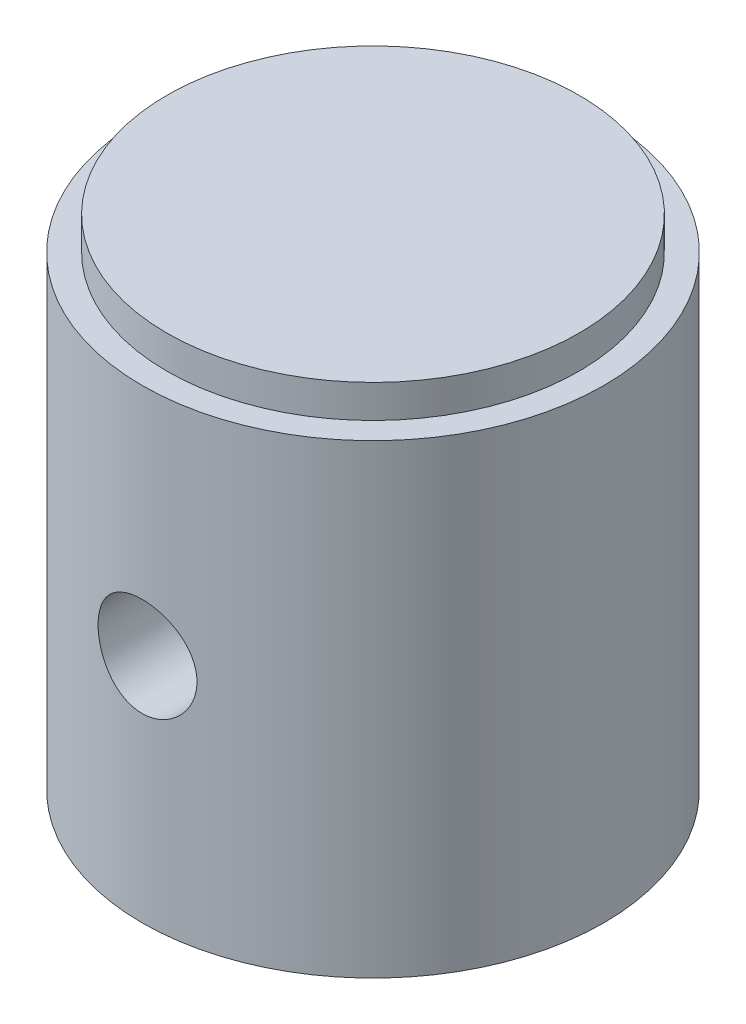
ISO-10303-21;
HEADER;
FILE_DESCRIPTION(('STEP AP214'),'2;1');
FILE_NAME('part.step','',(''),(''),'','','');
FILE_SCHEMA(('AUTOMOTIVE_DESIGN { 1 0 10303 214 1 1 1 1 }'));
ENDSEC;
DATA;
#1=APPLICATION_CONTEXT('core data for automotive mechanical design processes');
#2=APPLICATION_PROTOCOL_DEFINITION('international standard','automotive_design',2000,#1);
#3=PRODUCT_CONTEXT('',#1,'mechanical');
#4=PRODUCT('Part','Part','',(#3));
#5=PRODUCT_RELATED_PRODUCT_CATEGORY('part','',(#4));
#6=PRODUCT_DEFINITION_FORMATION('','',#4);
#7=PRODUCT_DEFINITION_CONTEXT('part definition',#1,'design');
#8=PRODUCT_DEFINITION('design','',#6,#7);
#9=PRODUCT_DEFINITION_SHAPE('','',#8);
#10=(LENGTH_UNIT() NAMED_UNIT(*) SI_UNIT(.MILLI.,.METRE.));
#11=(NAMED_UNIT(*) PLANE_ANGLE_UNIT() SI_UNIT($,.RADIAN.));
#12=(NAMED_UNIT(*) SI_UNIT($,.STERADIAN.) SOLID_ANGLE_UNIT());
#13=UNCERTAINTY_MEASURE_WITH_UNIT(LENGTH_MEASURE(1.E-05),#10,'distance_accuracy_value','');
#14=(GEOMETRIC_REPRESENTATION_CONTEXT(3) GLOBAL_UNCERTAINTY_ASSIGNED_CONTEXT((#13)) GLOBAL_UNIT_ASSIGNED_CONTEXT((#10,
#11,#12)) REPRESENTATION_CONTEXT('',''));
#15=CARTESIAN_POINT('',(0.,0.,0.));
#16=DIRECTION('',(0.,0.,1.));
#17=DIRECTION('',(1.,0.,0.));
#18=AXIS2_PLACEMENT_3D('',#15,#16,#17);
#19=CARTESIAN_POINT('',(0.,15.9635891289645,0.));
#20=DIRECTION('',(0.,-1.,0.));
#21=DIRECTION('',(0.,0.,-1.));
#22=AXIS2_PLACEMENT_3D('',#19,#20,#21);
#23=CONICAL_SURFACE('',#22,4.39164814667686,0.349065850398866);
#24=CARTESIAN_POINT('',(0.,11.9866629451071,0.));
#25=DIRECTION('',(0.,1.,0.));
#26=DIRECTION('',(0.,0.,1.));
#27=AXIS2_PLACEMENT_3D('',#24,#25,#26);
#28=CIRCLE('',#27,5.83913090147486);
#29=CARTESIAN_POINT('',(0.,11.9866629451071,5.83913090147486));
#30=VERTEX_POINT('',#29);
#31=EDGE_CURVE('E82',#30,#30,#28,.T.);
#32=ORIENTED_EDGE('',*,*,#31,.F.);
#33=EDGE_LOOP('',(#32));
#34=FACE_BOUND('',#33,.T.);
#35=CARTESIAN_POINT('',(0.,15.9635891289645,0.));
#36=DIRECTION('',(0.,1.,0.));
#37=DIRECTION('',(0.,0.,1.));
#38=AXIS2_PLACEMENT_3D('',#35,#36,#37);
#39=CIRCLE('',#38,4.39164814667686);
#40=CARTESIAN_POINT('',(0.,15.9635891289645,4.39164814667686));
#41=VERTEX_POINT('',#40);
#42=EDGE_CURVE('E85',#41,#41,#39,.T.);
#43=ORIENTED_EDGE('',*,*,#42,.T.);
#44=EDGE_LOOP('',(#43));
#45=FACE_BOUND('',#44,.T.);
#46=ADVANCED_FACE('F45',(#34,#45),#23,.F.);
#47=CARTESIAN_POINT('',(0.,-49.5119169152262,0.));
#48=DIRECTION('',(0.,1.,0.));
#49=DIRECTION('',(0.,0.,1.));
#50=AXIS2_PLACEMENT_3D('',#47,#48,#49);
#51=CYLINDRICAL_SURFACE('',#50,4.39164814667687);
#52=CARTESIAN_POINT('',(0.,17.4866629451071,4.39164814667687));
#53=CARTESIAN_POINT('',(0.0817294489079291,17.4866621455379,4.39164868377156));
#54=CARTESIAN_POINT('',(0.163453316832551,17.4933642389555,4.38934582266555));
#55=CARTESIAN_POINT('',(0.32448701010321,17.5199085710752,4.38038667126236));
#56=CARTESIAN_POINT('',(0.403796702768455,17.5397515306281,4.37373014214215));
#57=CARTESIAN_POINT('',(0.557657274641662,17.5918132402795,4.35678530776044));
#58=CARTESIAN_POINT('',(0.632216089607796,17.6240106862873,4.34650325681346));
#59=CARTESIAN_POINT('',(0.774874499462276,17.6997688133632,4.32335198157691));
#60=CARTESIAN_POINT('',(0.842972718736372,17.7433319070758,4.31048220811133));
#61=CARTESIAN_POINT('',(0.973238412709967,17.8422368756258,4.28298482885952));
#62=CARTESIAN_POINT('',(1.03514032978878,17.8979163065187,4.26831360910754));
#63=CARTESIAN_POINT('',(1.14893297228971,18.0187560367412,4.23910183809452));
#64=CARTESIAN_POINT('',(1.2008213430564,18.083918559688,4.2245613183317));
#65=CARTESIAN_POINT('',(1.29466178519018,18.2243036745552,4.19677232209295));
#66=CARTESIAN_POINT('',(1.33626305373444,18.2997722378693,4.18357669220338));
#67=CARTESIAN_POINT('',(1.40606835780822,18.4571579794045,4.16063760334802));
#68=CARTESIAN_POINT('',(1.4342767159436,18.5390730670246,4.15089303080048));
#69=CARTESIAN_POINT('',(1.4754892588746,18.7039985651193,4.13641992382677));
#70=CARTESIAN_POINT('',(1.48899294541784,18.7868693048427,4.13152713917476));
#71=CARTESIAN_POINT('',(1.50197455192036,18.9538336434625,4.1268266437341));
#72=CARTESIAN_POINT('',(1.50145706573326,19.0379268328144,4.12701726743296));
#73=CARTESIAN_POINT('',(1.48679770855611,19.2006334004601,4.13231854511336));
#74=CARTESIAN_POINT('',(1.47331502490099,19.279315288484,4.13719114498535));
#75=CARTESIAN_POINT('',(1.4341860672897,19.4332246434377,4.15091667228524));
#76=CARTESIAN_POINT('',(1.40853826854911,19.5084516760365,4.15977009866559));
#77=CARTESIAN_POINT('',(1.34538918588757,19.6547840356847,4.18062422299566));
#78=CARTESIAN_POINT('',(1.30769729040637,19.725799664015,4.19267496230931));
#79=CARTESIAN_POINT('',(1.22166231658171,19.8607032099629,4.21854574298595));
#80=CARTESIAN_POINT('',(1.17331604024451,19.924588978807,4.23236631505488));
#81=CARTESIAN_POINT('',(1.06420712885222,20.0471135374331,4.26114840187691));
#82=CARTESIAN_POINT('',(1.00290788851852,20.1052705701218,4.27613086375615));
#83=CARTESIAN_POINT('',(0.87124387820915,20.2106084476315,4.304885913468));
#84=CARTESIAN_POINT('',(0.8008781508798,20.2577881318479,4.31865837327471));
#85=CARTESIAN_POINT('',(0.652018066727931,20.3402459996646,4.34363848422722));
#86=CARTESIAN_POINT('',(0.573443661374297,20.3753892304839,4.35481662662775));
#87=CARTESIAN_POINT('',(0.411024251083065,20.4318073226368,4.37313368929884));
#88=CARTESIAN_POINT('',(0.327181184841325,20.4530872528281,4.3802740857698));
#89=CARTESIAN_POINT('',(0.160678405267679,20.4803075784225,4.38946373737868));
#90=CARTESIAN_POINT('',(0.0781368141622372,20.4868985053727,4.39172874280258));
#91=CARTESIAN_POINT('',(-0.0868930585426334,20.48641460634,4.3915631859922));
#92=CARTESIAN_POINT('',(-0.169381347025898,20.4793422183669,4.3891334614607));
#93=CARTESIAN_POINT('',(-0.329320417110254,20.452243752027,4.37999397769655));
#94=CARTESIAN_POINT('',(-0.406848105795428,20.4326220127882,4.37341790392502));
#95=CARTESIAN_POINT('',(-0.557475785158268,20.3814924007068,4.35678101776047));
#96=CARTESIAN_POINT('',(-0.630575205061437,20.3499829993904,4.34671975726803));
#97=CARTESIAN_POINT('',(-0.772473530662593,20.2750327059894,4.32379071886488));
#98=CARTESIAN_POINT('',(-0.841103024157171,20.23129262304,4.31085449721638));
#99=CARTESIAN_POINT('',(-0.970256721934481,20.133471301674,4.28363615970865));
#100=CARTESIAN_POINT('',(-1.03077833280666,20.0793867678174,4.26935361568778));
#101=CARTESIAN_POINT('',(-1.14501370005639,19.9593552609766,4.24018401929921));
#102=CARTESIAN_POINT('',(-1.19826342695204,19.8929646616378,4.22530072481728));
#103=CARTESIAN_POINT('',(-1.29292999308279,19.7518741193231,4.19730273974648));
#104=CARTESIAN_POINT('',(-1.33434658802126,19.6771740048402,4.1841880856744));
#105=CARTESIAN_POINT('',(-1.40401396111918,19.5214606296706,4.16133018844269));
#106=CARTESIAN_POINT('',(-1.43227898649158,19.4404543121625,4.15158329991396));
#107=CARTESIAN_POINT('',(-1.47462798737459,19.2744185102167,4.13673291102075));
#108=CARTESIAN_POINT('',(-1.48871877878341,19.1893909800559,4.13162717899874));
#109=CARTESIAN_POINT('',(-1.50177175304058,19.0226554304118,4.12689935809998));
#110=CARTESIAN_POINT('',(-1.50150798647739,18.9410153211936,4.12699669527901));
#111=CARTESIAN_POINT('',(-1.48777921967001,18.7790083793351,4.13196545357263));
#112=CARTESIAN_POINT('',(-1.47431508209315,18.6986414638381,4.13683656271288));
#113=CARTESIAN_POINT('',(-1.43512698691884,18.543145259109,4.1505901275787));
#114=CARTESIAN_POINT('',(-1.4096658274347,18.4679415082207,4.15938639271439));
#115=CARTESIAN_POINT('',(-1.34742242646437,18.322817528992,4.17996359025081));
#116=CARTESIAN_POINT('',(-1.31063759551856,18.2528985137071,4.19174520522234));
#117=CARTESIAN_POINT('',(-1.22484385472821,18.1168854961681,4.21763235933257));
#118=CARTESIAN_POINT('',(-1.17535571002989,18.0511093566584,4.2318191322824));
#119=CARTESIAN_POINT('',(-1.06635703907746,17.9285455596253,4.26059028583725));
#120=CARTESIAN_POINT('',(-1.00684361313577,17.8717605119078,4.27517478045248));
#121=CARTESIAN_POINT('',(-0.876506754559086,17.7663988229198,4.30382818864186));
#122=CARTESIAN_POINT('',(-0.805315233172752,17.7182631106815,4.31785025563202));
#123=CARTESIAN_POINT('',(-0.655382269904838,17.6346882249808,4.34313447974377));
#124=CARTESIAN_POINT('',(-0.576642314857642,17.599246557627,4.35439717883747));
#125=CARTESIAN_POINT('',(-0.416110739990495,17.5430994004204,4.37261495143624));
#126=CARTESIAN_POINT('',(-0.334467846195728,17.5220064467444,4.37968256887808));
#127=CARTESIAN_POINT('',(-0.168547437479504,17.4937908083581,4.38919816970531));
#128=CARTESIAN_POINT('',(-0.0842707520145162,17.4866637695382,4.3916475928817));
#129=CARTESIAN_POINT('',(0.,17.4866629451071,4.39164814667687));
#130=B_SPLINE_CURVE_WITH_KNOTS('',3,(#52,#53,#54,#55,#56,#57,#58,#59,#60,#61,#62,#63,#64,#65,
#66,#67,#68,#69,#70,#71,#72,#73,#74,#75,#76,#77,#78,#79,#80,#81,#82,#83,#84,#85,#86,#87,#88,#89,
#90,#91,#92,#93,#94,#95,#96,#97,#98,#99,#100,#101,#102,#103,#104,#105,#106,#107,#108,#109,#110,
#111,#112,#113,#114,#115,#116,#117,#118,#119,#120,#121,#122,#123,#124,#125,#126,#127,#128,#129),
.UNSPECIFIED.,.T.,.F.,(4,2,2,2,2,2,2,2,2,2,2,2,2,2,2,2,2,2,2,2,2,2,2,2,2,2,2,2,2,2,2,2,2,2,2,2,
2,2,4),(0.,0.244878092312964,0.48976961868451,0.734240737947286,0.978763794637306,
1.23125460753623,1.48380472074113,1.74404752024375,2.0042062683331,2.25522187058788,
2.50615523186281,2.74496993743776,2.98381458413539,3.22664383755001,3.46954607753362,
3.72580633365091,3.9820936711568,4.24116702775416,4.50014560576207,4.74740560419927,
4.99462148694344,5.23424793112643,5.4739051961398,5.7200334642486,5.96624027263004,
6.224222253085,6.4822095592284,6.73991673096274,6.99749992091901,7.24120779338095,
7.48489974016897,7.72348547718088,7.96212581376781,8.21160260004413,8.46115166865687,
8.72110491934582,8.98100707117217,9.23357818156781,9.48607053612094),.UNSPECIFIED.);
#131=CARTESIAN_POINT('',(0.,17.4866629451071,4.39164814667687));
#132=VERTEX_POINT('',#131);
#133=EDGE_CURVE('E121',#132,#132,#130,.T.);
#134=ORIENTED_EDGE('',*,*,#133,.T.);
#135=EDGE_LOOP('',(#134));
#136=FACE_BOUND('',#135,.T.);
#137=CARTESIAN_POINT('',(1.5,18.9866629451071,-4.12753842431665));
#138=CARTESIAN_POINT('',(1.50000082168969,18.905090741638,-4.12753776802314));
#139=CARTESIAN_POINT('',(1.49332353569018,18.8235241701129,-4.12998298646659));
#140=CARTESIAN_POINT('',(1.4668867012329,18.6628157309487,-4.13944559893389));
#141=CARTESIAN_POINT('',(1.44712553061846,18.5836741652382,-4.14646355989046));
#142=CARTESIAN_POINT('',(1.39530261703718,18.4301715327416,-4.16418599569134));
#143=CARTESIAN_POINT('',(1.36326596428262,18.3558010737696,-4.17488294640475));
#144=CARTESIAN_POINT('',(1.28788785512723,18.2134651924809,-4.1987469237015));
#145=CARTESIAN_POINT('',(1.24454371444012,18.1455012962414,-4.21191453658703));
#146=CARTESIAN_POINT('',(1.14587251993171,18.0151141462898,-4.23984309575802));
#147=CARTESIAN_POINT('',(1.09015855078304,17.9529924277334,-4.25464517134597));
#148=CARTESIAN_POINT('',(0.969154040495169,17.838767132552,-4.28382807781682));
#149=CARTESIAN_POINT('',(0.90386187671285,17.7866652568528,-4.2982088368282));
#150=CARTESIAN_POINT('',(0.763333565607492,17.6925747389467,-4.32540736861484));
#151=CARTESIAN_POINT('',(0.687873016031454,17.6509042667316,-4.33817116518836));
#152=CARTESIAN_POINT('',(0.530502088688649,17.5809690691957,-4.36021120680658));
#153=CARTESIAN_POINT('',(0.448593549536994,17.5527005384011,-4.36948844170322));
#154=CARTESIAN_POINT('',(0.283814925272902,17.511400757246,-4.38321862964434));
#155=CARTESIAN_POINT('',(0.201088289240174,17.4978524706151,-4.38783484860134));
#156=CARTESIAN_POINT('',(0.0344156168699315,17.4847313858393,-4.39230362929179));
#157=CARTESIAN_POINT('',(-0.0495300836784204,17.4851548095508,-4.39215747883587));
#158=CARTESIAN_POINT('',(-0.212589662791825,17.4996422240224,-4.38722735475652));
#159=CARTESIAN_POINT('',(-0.291760215645155,17.5131441355059,-4.38263449304));
#160=CARTESIAN_POINT('',(-0.446635543949271,17.5524727420209,-4.36956897124297));
#161=CARTESIAN_POINT('',(-0.522340081312606,17.5783002823362,-4.36109604507169));
#162=CARTESIAN_POINT('',(-0.669335876808592,17.6418620438708,-4.34098435642751));
#163=CARTESIAN_POINT('',(-0.740553964802353,17.6797519399631,-4.32930449322565));
#164=CARTESIAN_POINT('',(-0.875783718132818,17.7662329568174,-4.30398840555528));
#165=CARTESIAN_POINT('',(-0.939793303005812,17.8148271550735,-4.29035161886377));
#166=CARTESIAN_POINT('',(-1.06212770860564,17.9241469920349,-4.26176013734627));
#167=CARTESIAN_POINT('',(-1.12001696037134,17.9853524411183,-4.24677361314111));
#168=CARTESIAN_POINT('',(-1.22485514449448,18.1167239167797,-4.2177327866017));
#169=CARTESIAN_POINT('',(-1.27180221083371,18.1868914685501,-4.20367864356234));
#170=CARTESIAN_POINT('',(-1.35406764887452,18.3356383966793,-4.17791439957714));
#171=CARTESIAN_POINT('',(-1.38919284200223,18.4143320858488,-4.16624435941531));
#172=CARTESIAN_POINT('',(-1.4455420932564,18.5770173008069,-4.14703246999969));
#173=CARTESIAN_POINT('',(-1.46677232837125,18.6610064542725,-4.13948878662382));
#174=CARTESIAN_POINT('',(-1.49382277338146,18.8276617006459,-4.12980203941904));
#175=CARTESIAN_POINT('',(-1.50032161697312,18.9102038271835,-4.12742136976467));
#176=CARTESIAN_POINT('',(-1.4996540057478,19.0752160372166,-4.12766433780734));
#177=CARTESIAN_POINT('',(-1.49249019472656,19.1576861315613,-4.13028700733189));
#178=CARTESIAN_POINT('',(-1.46531160253188,19.3170550539137,-4.14000338633843));
#179=CARTESIAN_POINT('',(-1.44577800656954,19.3940472726432,-4.14692950906806));
#180=CARTESIAN_POINT('',(-1.39499695848995,19.5436424487913,-4.16428528665989));
#181=CARTESIAN_POINT('',(-1.36374736531904,19.6162446011242,-4.17471558185999));
#182=CARTESIAN_POINT('',(-1.28925495863953,19.7576473980019,-4.19832888554892));
#183=CARTESIAN_POINT('',(-1.24565140861712,19.8262444010803,-4.21159116521276));
#184=CARTESIAN_POINT('',(-1.14809275318166,19.9553925492633,-4.23922433758061));
#185=CARTESIAN_POINT('',(-1.09413445090866,20.0159411997738,-4.25359557183476));
#186=CARTESIAN_POINT('',(-0.974137426133304,20.1304627229803,-4.28271240556555));
#187=CARTESIAN_POINT('',(-0.907623483051031,20.1839437808015,-4.29743980677646));
#188=CARTESIAN_POINT('',(-0.766202064374844,20.2790222514691,-4.32489176968491));
#189=CARTESIAN_POINT('',(-0.691294840229133,20.3206200201858,-4.33761639135481));
#190=CARTESIAN_POINT('',(-0.535538073527392,20.3903839590561,-4.35957712746559));
#191=CARTESIAN_POINT('',(-0.454728284774517,20.4186318662402,-4.36883439702513));
#192=CARTESIAN_POINT('',(-0.289124504004693,20.4610118031495,-4.38290696204868));
#193=CARTESIAN_POINT('',(-0.204332043286315,20.4751492124509,-4.38772395030032));
#194=CARTESIAN_POINT('',(-0.0376575072471233,20.488403849691,-4.3922391457449));
#195=CARTESIAN_POINT('',(0.0441626297124419,20.4882255410696,-4.39217743183745));
#196=CARTESIAN_POINT('',(0.206552935182313,20.4746056101795,-4.38753984622684));
#197=CARTESIAN_POINT('',(0.287123213132928,20.4611651559071,-4.38296437205025));
#198=CARTESIAN_POINT('',(0.443327019844538,20.4218762407992,-4.36990589168689));
#199=CARTESIAN_POINT('',(0.519021996071786,20.396247395663,-4.3614921503824));
#200=CARTESIAN_POINT('',(0.665063041801831,20.3335150754084,-4.34162432608134));
#201=CARTESIAN_POINT('',(0.735408126026054,20.2964094929881,-4.33016968478448));
#202=CARTESIAN_POINT('',(0.871674798054124,20.2101541630808,-4.304851173411));
#203=CARTESIAN_POINT('',(0.937326028686874,20.1605996705962,-4.2909121852118));
#204=CARTESIAN_POINT('',(1.05960913339235,20.0515316959507,-4.26236459857881));
#205=CARTESIAN_POINT('',(1.11623804604061,19.9920149569403,-4.2477557823031));
#206=CARTESIAN_POINT('',(1.2212741499418,19.8617492316842,-4.2187863610964));
#207=CARTESIAN_POINT('',(1.26924034950629,19.7906355114943,-4.20446147282496));
#208=CARTESIAN_POINT('',(1.35251569760637,19.640906834185,-4.17841923761428));
#209=CARTESIAN_POINT('',(1.38782735644033,19.5622933687224,-4.16670137369117));
#210=CARTESIAN_POINT('',(1.44376392213005,19.4020406044319,-4.14764676379814));
#211=CARTESIAN_POINT('',(1.46478007516901,19.320552199731,-4.14019427664255));
#212=CARTESIAN_POINT('',(1.49289495392524,19.1549274785295,-4.13014139934832));
#213=CARTESIAN_POINT('',(1.49999915255256,19.070792216533,-4.12753910118318));
#214=CARTESIAN_POINT('',(1.5,18.9866629451071,-4.12753842431665));
#215=B_SPLINE_CURVE_WITH_KNOTS('',3,(#137,#138,#139,#140,#141,#142,#143,#144,#145,#146,#147,
#148,#149,#150,#151,#152,#153,#154,#155,#156,#157,#158,#159,#160,#161,#162,#163,#164,#165,#166,
#167,#168,#169,#170,#171,#172,#173,#174,#175,#176,#177,#178,#179,#180,#181,#182,#183,#184,#185,
#186,#187,#188,#189,#190,#191,#192,#193,#194,#195,#196,#197,#198,#199,#200,#201,#202,#203,#204,
#205,#206,#207,#208,#209,#210,#211,#212,#213,#214),.UNSPECIFIED.,.T.,.F.,(4,2,2,2,2,2,2,2,2,2,2,
2,2,2,2,2,2,2,2,2,2,2,2,2,2,2,2,2,2,2,2,2,2,2,2,2,2,2,4),(0.,0.244404735900085,0.48883977908599,
0.732777856727943,0.976773895645874,1.22987815307066,1.48302533854185,1.74314682558252,
2.00319440696884,2.25377913839717,2.50429610880689,2.74450333591049,2.98472703864229,
3.22818608438393,3.47171521632842,3.72724496295225,3.98281825433752,4.24238524010341,
4.50183675713166,4.74906967726474,4.99625476137741,5.23436989468717,5.47252856385383,
5.71852228023797,5.9645920656878,6.22319139473151,6.48178297865627,6.73877009070058,
6.99565918986938,7.23991514880328,7.48414959805016,7.72414106107531,7.96417661633617,
8.21335036888038,8.4626057407775,8.72224879245798,8.98184030984735,9.23400569404477,
9.48607185739303),.UNSPECIFIED.);
#216=CARTESIAN_POINT('',(1.5,18.9866629451071,-4.12753842431665));
#217=VERTEX_POINT('',#216);
#218=EDGE_CURVE('E115',#217,#217,#215,.T.);
#219=ORIENTED_EDGE('',*,*,#218,.T.);
#220=EDGE_LOOP('',(#219));
#221=FACE_BOUND('',#220,.T.);
#222=ORIENTED_EDGE('',*,*,#42,.F.);
#223=EDGE_LOOP('',(#222));
#224=FACE_BOUND('',#223,.T.);
#225=CARTESIAN_POINT('',(0.,22.9635891289646,0.));
#226=DIRECTION('',(0.,1.,0.));
#227=DIRECTION('',(0.,0.,1.));
#228=AXIS2_PLACEMENT_3D('',#225,#226,#227);
#229=CIRCLE('',#228,4.39164814667687);
#230=CARTESIAN_POINT('',(0.,22.9635891289646,4.39164814667687));
#231=VERTEX_POINT('',#230);
#232=EDGE_CURVE('E88',#231,#231,#229,.T.);
#233=ORIENTED_EDGE('',*,*,#232,.T.);
#234=EDGE_LOOP('',(#233));
#235=FACE_BOUND('',#234,.T.);
#236=ADVANCED_FACE('F63',(#136,#221,#224,#235),#51,.F.);
#237=CARTESIAN_POINT('',(0.,25.6023575529281,0.));
#238=DIRECTION('',(0.,-1.,0.));
#239=DIRECTION('',(0.,0.,-1.));
#240=AXIS2_PLACEMENT_3D('',#237,#238,#239);
#241=CONICAL_SURFACE('',#240,0.,1.02974425867665);
#242=ORIENTED_EDGE('',*,*,#232,.F.);
#243=EDGE_LOOP('',(#242));
#244=FACE_BOUND('',#243,.T.);
#245=CARTESIAN_POINT('',(0.,25.6023575529281,0.));
#246=VERTEX_POINT('',#245);
#247=VERTEX_LOOP('',#246);
#248=FACE_BOUND('',#247,.T.);
#249=ADVANCED_FACE('F60',(#244,#248),#241,.F.);
#250=CARTESIAN_POINT('',(0.,27.1023575529281,0.));
#251=DIRECTION('',(0.,1.,0.));
#252=DIRECTION('',(0.,0.,1.));
#253=AXIS2_PLACEMENT_3D('',#250,#251,#252);
#254=PLANE('',#253);
#255=CARTESIAN_POINT('',(0.,27.1023575529281,0.));
#256=DIRECTION('',(0.,1.,0.));
#257=DIRECTION('',(0.,0.,1.));
#258=AXIS2_PLACEMENT_3D('',#255,#256,#257);
#259=CIRCLE('',#258,6.25);
#260=CARTESIAN_POINT('',(0.,27.1023575529281,6.25));
#261=VERTEX_POINT('',#260);
#262=EDGE_CURVE('E94',#261,#261,#259,.T.);
#263=ORIENTED_EDGE('',*,*,#262,.T.);
#264=EDGE_LOOP('',(#263));
#265=FACE_BOUND('',#264,.T.);
#266=ADVANCED_FACE('F62',(#265),#254,.T.);
#267=CARTESIAN_POINT('',(0.,-49.5119169152262,0.));
#268=DIRECTION('',(0.,1.,0.));
#269=DIRECTION('',(0.,0.,1.));
#270=AXIS2_PLACEMENT_3D('',#267,#268,#269);
#271=CYLINDRICAL_SURFACE('',#270,6.25);
#272=CARTESIAN_POINT('',(0.,26.1023575529281,0.));
#273=DIRECTION('',(0.,1.,0.));
#274=DIRECTION('',(0.,0.,1.));
#275=AXIS2_PLACEMENT_3D('',#272,#273,#274);
#276=CIRCLE('',#275,6.25);
#277=CARTESIAN_POINT('',(0.,26.1023575529281,6.25));
#278=VERTEX_POINT('',#277);
#279=EDGE_CURVE('E140',#278,#278,#276,.T.);
#280=ORIENTED_EDGE('',*,*,#279,.T.);
#281=EDGE_LOOP('',(#280));
#282=FACE_BOUND('',#281,.T.);
#283=ORIENTED_EDGE('',*,*,#262,.F.);
#284=EDGE_LOOP('',(#283));
#285=FACE_BOUND('',#284,.T.);
#286=ADVANCED_FACE('F70',(#282,#285),#271,.T.);
#287=CARTESIAN_POINT('',(0.,26.1023575529281,0.));
#288=DIRECTION('',(0.,1.,0.));
#289=DIRECTION('',(0.,0.,1.));
#290=AXIS2_PLACEMENT_3D('',#287,#288,#289);
#291=PLANE('',#290);
#292=CARTESIAN_POINT('',(0.,26.1023575529281,0.));
#293=DIRECTION('',(0.,1.,0.));
#294=DIRECTION('',(0.,0.,1.));
#295=AXIS2_PLACEMENT_3D('',#292,#293,#294);
#296=CIRCLE('',#295,7.);
#297=CARTESIAN_POINT('',(0.,26.1023575529281,7.));
#298=VERTEX_POINT('',#297);
#299=EDGE_CURVE('E136',#298,#298,#296,.T.);
#300=ORIENTED_EDGE('',*,*,#299,.T.);
#301=EDGE_LOOP('',(#300));
#302=FACE_BOUND('',#301,.T.);
#303=ORIENTED_EDGE('',*,*,#279,.F.);
#304=EDGE_LOOP('',(#303));
#305=FACE_BOUND('',#304,.T.);
#306=ADVANCED_FACE('F148',(#302,#305),#291,.T.);
#307=CARTESIAN_POINT('',(0.,-49.5119169152262,0.));
#308=DIRECTION('',(0.,1.,0.));
#309=DIRECTION('',(0.,0.,1.));
#310=AXIS2_PLACEMENT_3D('',#307,#308,#309);
#311=CYLINDRICAL_SURFACE('',#310,7.);
#312=CARTESIAN_POINT('',(0.,20.4866629451071,-7.));
#313=CARTESIAN_POINT('',(0.0832358860906165,20.4866600455328,-6.99999846043226));
#314=CARTESIAN_POINT('',(0.166507195600274,20.4797113367192,-6.9985002594971));
#315=CARTESIAN_POINT('',(0.330687344293327,20.4521272882535,-6.99266829827727));
#316=CARTESIAN_POINT('',(0.41159440357119,20.4314819009122,-6.98833245637099));
#317=CARTESIAN_POINT('',(0.568649323817736,20.3771785804991,-6.97730831788826));
#318=CARTESIAN_POINT('',(0.644801963446554,20.3435339657258,-6.97062242967171));
#319=CARTESIAN_POINT('',(0.790378177960786,20.2642288589358,-6.95562106817971));
#320=CARTESIAN_POINT('',(0.859801981747369,20.2185687758572,-6.9473056503666));
#321=CARTESIAN_POINT('',(0.991024790535229,20.1157826454336,-6.92981369246311));
#322=CARTESIAN_POINT('',(1.05270503419445,20.0585067232086,-6.92062683143259));
#323=CARTESIAN_POINT('',(1.16566042389435,19.9344366294219,-6.90250069814144));
#324=CARTESIAN_POINT('',(1.21693467150908,19.8676416368558,-6.8935614473163));
#325=CARTESIAN_POINT('',(1.30814204379808,19.7255571922467,-6.87684116047225));
#326=CARTESIAN_POINT('',(1.34794958335009,19.6501854273509,-6.8690733634436));
#327=CARTESIAN_POINT('',(1.41428823691147,19.4936284913403,-6.85572325558537));
#328=CARTESIAN_POINT('',(1.44082087001716,19.4124439866145,-6.85014069470711));
#329=CARTESIAN_POINT('',(1.47946574422454,19.247851858519,-6.8418980892631));
#330=CARTESIAN_POINT('',(1.49178779748342,19.1644956694432,-6.83919556896486));
#331=CARTESIAN_POINT('',(1.50231395206577,18.9968587126001,-6.83689139845106));
#332=CARTESIAN_POINT('',(1.50051971664629,18.9125780549271,-6.83728938291729));
#333=CARTESIAN_POINT('',(1.48303326340861,18.7470382571733,-6.84110276603832));
#334=CARTESIAN_POINT('',(1.46758398649408,18.6657520560069,-6.84446541682162));
#335=CARTESIAN_POINT('',(1.42361054298677,18.5069527048178,-6.85374593375788));
#336=CARTESIAN_POINT('',(1.39508566936466,18.4294397590748,-6.85966393808402));
#337=CARTESIAN_POINT('',(1.32554551075991,18.2797000722338,-6.87344080755724));
#338=CARTESIAN_POINT('',(1.2844361097283,18.2075184323945,-6.88131420983365));
#339=CARTESIAN_POINT('',(1.19096007283993,18.0709877801491,-6.89810572501288));
#340=CARTESIAN_POINT('',(1.13859196103562,18.0066397964209,-6.90702397481896));
#341=CARTESIAN_POINT('',(1.0227954275532,17.8862035894337,-6.92512718393878));
#342=CARTESIAN_POINT('',(0.959160233964411,17.8303142385224,-6.93431383972177));
#343=CARTESIAN_POINT('',(0.823317306269097,17.7299692114174,-6.95175017497059));
#344=CARTESIAN_POINT('',(0.751109428775399,17.6855137265067,-6.95999983875972));
#345=CARTESIAN_POINT('',(0.599933462049959,17.6092522652002,-6.97465778534003));
#346=CARTESIAN_POINT('',(0.520952258863484,17.5774715325291,-6.98106238643354));
#347=CARTESIAN_POINT('',(0.358603146685708,17.527687296786,-6.99128109245334));
#348=CARTESIAN_POINT('',(0.27523585113367,17.5096818725438,-6.99509555860384));
#349=CARTESIAN_POINT('',(0.108187670836629,17.4882467309637,-6.99965306347808));
#350=CARTESIAN_POINT('',(0.0245431772716148,17.4845452322253,-7.00045336521066));
#351=CARTESIAN_POINT('',(-0.142168973650404,17.4910875162323,-6.99905248935969));
#352=CARTESIAN_POINT('',(-0.225236668127255,17.50133039307,-6.99685150675698));
#353=CARTESIAN_POINT('',(-0.387542537982806,17.5352451887688,-6.98973143045266));
#354=CARTESIAN_POINT('',(-0.466811712908478,17.5587753145796,-6.98484105045459));
#355=CARTESIAN_POINT('',(-0.620278450473419,17.6184398881019,-6.9728892442151));
#356=CARTESIAN_POINT('',(-0.69447559258774,17.6545753794188,-6.96582763822237));
#357=CARTESIAN_POINT('',(-0.836821397964753,17.7389964881674,-6.950175043904));
#358=CARTESIAN_POINT('',(-0.90487257511114,17.7874427400168,-6.94156431354275));
#359=CARTESIAN_POINT('',(-1.0319769255236,17.8948977699958,-6.92381033034847));
#360=CARTESIAN_POINT('',(-1.091028978692,17.9539078609945,-6.91466701142097));
#361=CARTESIAN_POINT('',(-1.19952711057989,18.0820603152942,-6.89668172706324));
#362=CARTESIAN_POINT('',(-1.24878537255156,18.1513630443292,-6.88784792221285));
#363=CARTESIAN_POINT('',(-1.3349641538604,18.2974175415851,-6.87166654559681));
#364=CARTESIAN_POINT('',(-1.37188519913705,18.3741689920846,-6.86431891048055));
#365=CARTESIAN_POINT('',(-1.43209741248548,18.5325352441017,-6.8520100980739));
#366=CARTESIAN_POINT('',(-1.45546398641275,18.6141203015378,-6.84703574582967));
#367=CARTESIAN_POINT('',(-1.48812696085335,18.7801785289407,-6.84001186708418));
#368=CARTESIAN_POINT('',(-1.49742550780258,18.8646512563084,-6.83796189439706));
#369=CARTESIAN_POINT('',(-1.5015999992604,19.0321952882823,-6.83704618848155));
#370=CARTESIAN_POINT('',(-1.49677347258311,19.1152589600877,-6.83811476518543));
#371=CARTESIAN_POINT('',(-1.47349789406331,19.2793601872397,-6.8431676318483));
#372=CARTESIAN_POINT('',(-1.45504898957979,19.3603977644937,-6.84715189026714));
#373=CARTESIAN_POINT('',(-1.40519345940434,19.5179216029763,-6.85755581104157));
#374=CARTESIAN_POINT('',(-1.37382847170887,19.5944215937714,-6.86396764224703));
#375=CARTESIAN_POINT('',(-1.299067515956,19.7411183176139,-6.87850764590649));
#376=CARTESIAN_POINT('',(-1.255670353015,19.8113144237221,-6.88663598880363));
#377=CARTESIAN_POINT('',(-1.15708290349304,19.9448811388325,-6.90389055593232));
#378=CARTESIAN_POINT('',(-1.10167987421236,20.0080926410541,-6.91303309938926));
#379=CARTESIAN_POINT('',(-0.981086554619619,20.1244192076276,-6.93117449799694));
#380=CARTESIAN_POINT('',(-0.915894009385596,20.1775319394193,-6.94017331951296));
#381=CARTESIAN_POINT('',(-0.776603147268717,20.2727789046127,-6.95714491048987));
#382=CARTESIAN_POINT('',(-0.702404846009641,20.3147695513381,-6.96510364570626));
#383=CARTESIAN_POINT('',(-0.547850160940598,20.3856174740133,-6.97895826104019));
#384=CARTESIAN_POINT('',(-0.467499105863879,20.4144859676921,-6.98485590212343));
#385=CARTESIAN_POINT('',(-0.322535217553203,20.4530151302382,-6.99284848461772));
#386=CARTESIAN_POINT('',(-0.258717205545978,20.4656093790871,-6.99551391888263));
#387=CARTESIAN_POINT('',(-0.129939960853845,20.4824342468188,-6.99909024154719));
#388=CARTESIAN_POINT('',(-0.0649807750887444,20.4866652087532,-7.00000120191314));
#389=CARTESIAN_POINT('',(0.,20.4866629451071,-7.));
#390=B_SPLINE_CURVE_WITH_KNOTS('',3,(#312,#313,#314,#315,#316,#317,#318,#319,#320,#321,#322,
#323,#324,#325,#326,#327,#328,#329,#330,#331,#332,#333,#334,#335,#336,#337,#338,#339,#340,#341,
#342,#343,#344,#345,#346,#347,#348,#349,#350,#351,#352,#353,#354,#355,#356,#357,#358,#359,#360,
#361,#362,#363,#364,#365,#366,#367,#368,#369,#370,#371,#372,#373,#374,#375,#376,#377,#378,#379,
#380,#381,#382,#383,#384,#385,#386,#387,#388,#389),.UNSPECIFIED.,.T.,.F.,(4,2,2,2,2,2,2,2,2,2,2,
2,2,2,2,2,2,2,2,2,2,2,2,2,2,2,2,2,2,2,2,2,2,2,2,2,2,2,4),(0.,0.249469836512082,
0.499122883219936,0.7485208244256,0.997910278645884,1.25074961881732,1.50361077918506,
1.7591442921451,2.0146485567749,2.26633008124666,2.51798195169165,2.76524475452928,
3.01252092904568,3.26169356165968,3.51089887920889,3.76527011050291,4.0196455970235,
4.27452521139806,4.52936927256343,4.77934665704185,5.02930780231429,5.27665060589267,
5.52401389198434,5.77478733867803,6.02559197304485,6.28082063283534,6.53603841075805,
6.78982240408474,7.04356767229185,7.29200680540294,7.5404432510827,7.78808499706786,
8.03575134451623,8.28822950154114,8.54076590397115,8.79641910357222,9.05185334010271,
9.24661799132294,9.44137465337336),.UNSPECIFIED.);
#391=CARTESIAN_POINT('',(0.,20.4866629451071,-7.));
#392=VERTEX_POINT('',#391);
#393=EDGE_CURVE('E11',#392,#392,#390,.T.);
#394=ORIENTED_EDGE('',*,*,#393,.F.);
#395=EDGE_LOOP('',(#394));
#396=FACE_BOUND('',#395,.T.);
#397=CARTESIAN_POINT('',(0.,17.4866629451071,7.));
#398=CARTESIAN_POINT('',(0.0832358860906168,17.4866658446814,6.99999846043226));
#399=CARTESIAN_POINT('',(0.166507195600275,17.493614553495,6.9985002594971));
#400=CARTESIAN_POINT('',(0.330687344293327,17.5211986019607,6.99266829827727));
#401=CARTESIAN_POINT('',(0.41159440357119,17.541843989302,6.98833245637099));
#402=CARTESIAN_POINT('',(0.568649323817736,17.5961473097151,6.97730831788826));
#403=CARTESIAN_POINT('',(0.644801963446555,17.6297919244884,6.97062242967171));
#404=CARTESIAN_POINT('',(0.790378177960786,17.7090970312784,6.95562106817971));
#405=CARTESIAN_POINT('',(0.859801981747368,17.754757114357,6.94730565036661));
#406=CARTESIAN_POINT('',(0.991024790535228,17.8575432447806,6.92981369246311));
#407=CARTESIAN_POINT('',(1.05270503419445,17.9148191670056,6.92062683143259));
#408=CARTESIAN_POINT('',(1.16566042389435,18.0388892607923,6.90250069814144));
#409=CARTESIAN_POINT('',(1.21693467150908,18.1056842533584,6.8935614473163));
#410=CARTESIAN_POINT('',(1.30814204379809,18.2477686979675,6.87684116047225));
#411=CARTESIAN_POINT('',(1.34794958335009,18.3231404628633,6.8690733634436));
#412=CARTESIAN_POINT('',(1.41428823691148,18.4796973988739,6.85572325558537));
#413=CARTESIAN_POINT('',(1.44082087001716,18.5608819035997,6.85014069470711));
#414=CARTESIAN_POINT('',(1.47946574422454,18.7254740316952,6.8418980892631));
#415=CARTESIAN_POINT('',(1.49178779748342,18.808830220771,6.83919556896486));
#416=CARTESIAN_POINT('',(1.50231395206577,18.9764671776141,6.83689139845106));
#417=CARTESIAN_POINT('',(1.50051971664629,19.060747835287,6.83728938291729));
#418=CARTESIAN_POINT('',(1.48303326340861,19.2262876330409,6.84110276603832));
#419=CARTESIAN_POINT('',(1.46758398649408,19.3075738342073,6.84446541682162));
#420=CARTESIAN_POINT('',(1.42361054298677,19.4663731853964,6.85374593375788));
#421=CARTESIAN_POINT('',(1.39508566936466,19.5438861311394,6.85966393808402));
#422=CARTESIAN_POINT('',(1.32554551075991,19.6936258179804,6.87344080755724));
#423=CARTESIAN_POINT('',(1.2844361097283,19.7658074578197,6.88131420983365));
#424=CARTESIAN_POINT('',(1.19096007283993,19.9023381100651,6.89810572501288));
#425=CARTESIAN_POINT('',(1.13859196103562,19.9666860937933,6.90702397481896));
#426=CARTESIAN_POINT('',(1.0227954275532,20.0871223007805,6.92512718393878));
#427=CARTESIAN_POINT('',(0.959160233964411,20.1430116516918,6.93431383972177));
#428=CARTESIAN_POINT('',(0.823317306269097,20.2433566787968,6.95175017497059));
#429=CARTESIAN_POINT('',(0.751109428775399,20.2878121637075,6.95999983875972));
#430=CARTESIAN_POINT('',(0.599933462049958,20.364073625014,6.97465778534003));
#431=CARTESIAN_POINT('',(0.520952258863482,20.3958543576851,6.98106238643354));
#432=CARTESIAN_POINT('',(0.358603146685707,20.4456385934282,6.99128109245334));
#433=CARTESIAN_POINT('',(0.275235851133669,20.4636440176704,6.99509555860384));
#434=CARTESIAN_POINT('',(0.108187670836629,20.4850791592505,6.99965306347808));
#435=CARTESIAN_POINT('',(0.0245431772716149,20.4887806579889,7.00045336521066));
#436=CARTESIAN_POINT('',(-0.142168973650404,20.4822383739819,6.99905248935969));
#437=CARTESIAN_POINT('',(-0.225236668127255,20.4719954971442,6.99685150675698));
#438=CARTESIAN_POINT('',(-0.387542537982805,20.4380807014454,6.98973143045266));
#439=CARTESIAN_POINT('',(-0.466811712908478,20.4145505756346,6.98484105045459));
#440=CARTESIAN_POINT('',(-0.620278450473418,20.3548860021123,6.9728892442151));
#441=CARTESIAN_POINT('',(-0.69447559258774,20.3187505107954,6.96582763822237));
#442=CARTESIAN_POINT('',(-0.836821397964753,20.2343294020468,6.950175043904));
#443=CARTESIAN_POINT('',(-0.904872575111139,20.1858831501974,6.94156431354275));
#444=CARTESIAN_POINT('',(-1.03197692552359,20.0784281202184,6.92381033034847));
#445=CARTESIAN_POINT('',(-1.091028978692,20.0194180292197,6.91466701142097));
#446=CARTESIAN_POINT('',(-1.19952711057989,19.89126557492,6.89668172706324));
#447=CARTESIAN_POINT('',(-1.24878537255156,19.821962845885,6.88784792221285));
#448=CARTESIAN_POINT('',(-1.3349641538604,19.6759083486291,6.87166654559681));
#449=CARTESIAN_POINT('',(-1.37188519913705,19.5991568981296,6.86431891048055));
#450=CARTESIAN_POINT('',(-1.43209741248548,19.4407906461125,6.8520100980739));
#451=CARTESIAN_POINT('',(-1.45546398641275,19.3592055886764,6.84703574582967));
#452=CARTESIAN_POINT('',(-1.48812696085335,19.1931473612735,6.84001186708418));
#453=CARTESIAN_POINT('',(-1.49742550780258,19.1086746339058,6.83796189439706));
#454=CARTESIAN_POINT('',(-1.5015999992604,18.9411306019319,6.83704618848155));
#455=CARTESIAN_POINT('',(-1.49677347258311,18.8580669301265,6.83811476518543));
#456=CARTESIAN_POINT('',(-1.47349789406331,18.6939657029745,6.8431676318483));
#457=CARTESIAN_POINT('',(-1.45504898957979,18.6129281257205,6.84715189026714));
#458=CARTESIAN_POINT('',(-1.40519345940434,18.4554042872379,6.85755581104157));
#459=CARTESIAN_POINT('',(-1.37382847170887,18.3789042964428,6.86396764224703));
#460=CARTESIAN_POINT('',(-1.29906751595601,18.2322075726002,6.87850764590649));
#461=CARTESIAN_POINT('',(-1.255670353015,18.1620114664921,6.88663598880363));
#462=CARTESIAN_POINT('',(-1.15708290349304,18.0284447513817,6.90389055593232));
#463=CARTESIAN_POINT('',(-1.10167987421237,17.9652332491601,6.91303309938926));
#464=CARTESIAN_POINT('',(-0.98108655461962,17.8489066825866,6.93117449799694));
#465=CARTESIAN_POINT('',(-0.915894009385597,17.7957939507949,6.94017331951296));
#466=CARTESIAN_POINT('',(-0.776603147268717,17.7005469856015,6.95714491048987));
#467=CARTESIAN_POINT('',(-0.702404846009641,17.6585563388761,6.96510364570626));
#468=CARTESIAN_POINT('',(-0.547850160940597,17.5877084162009,6.97895826104019));
#469=CARTESIAN_POINT('',(-0.467499105863879,17.5588399225221,6.98485590212342));
#470=CARTESIAN_POINT('',(-0.322535217553204,17.5203107599759,6.99284848461772));
#471=CARTESIAN_POINT('',(-0.25871720554598,17.5077165111271,6.99551391888263));
#472=CARTESIAN_POINT('',(-0.129939960853847,17.4908916433954,6.99909024154719));
#473=CARTESIAN_POINT('',(-0.0649807750887453,17.486660681461,7.00000120191314));
#474=CARTESIAN_POINT('',(0.,17.4866629451071,7.));
#475=B_SPLINE_CURVE_WITH_KNOTS('',3,(#397,#398,#399,#400,#401,#402,#403,#404,#405,#406,#407,
#408,#409,#410,#411,#412,#413,#414,#415,#416,#417,#418,#419,#420,#421,#422,#423,#424,#425,#426,
#427,#428,#429,#430,#431,#432,#433,#434,#435,#436,#437,#438,#439,#440,#441,#442,#443,#444,#445,
#446,#447,#448,#449,#450,#451,#452,#453,#454,#455,#456,#457,#458,#459,#460,#461,#462,#463,#464,
#465,#466,#467,#468,#469,#470,#471,#472,#473,#474),.UNSPECIFIED.,.T.,.F.,(4,2,2,2,2,2,2,2,2,2,2,
2,2,2,2,2,2,2,2,2,2,2,2,2,2,2,2,2,2,2,2,2,2,2,2,2,2,2,4),(0.,0.249469836512082,
0.499122883219935,0.748520824425601,0.997910278645885,1.25074961881732,1.50361077918506,
1.7591442921451,2.01464855677489,2.26633008124665,2.51798195169165,2.76524475452927,
3.01252092904568,3.26169356165968,3.51089887920889,3.76527011050291,4.0196455970235,
4.27452521139806,4.52936927256343,4.77934665704185,5.02930780231429,5.27665060589267,
5.52401389198434,5.77478733867803,6.02559197304484,6.28082063283533,6.53603841075805,
6.78982240408474,7.04356767229184,7.29200680540294,7.5404432510827,7.78808499706785,
8.03575134451623,8.28822950154114,8.54076590397115,8.79641910357222,9.05185334010271,
9.24661799132294,9.44137465337336),.UNSPECIFIED.);
#476=CARTESIAN_POINT('',(0.,17.4866629451071,7.));
#477=VERTEX_POINT('',#476);
#478=EDGE_CURVE('E57',#477,#477,#475,.T.);
#479=ORIENTED_EDGE('',*,*,#478,.F.);
#480=EDGE_LOOP('',(#479));
#481=FACE_BOUND('',#480,.T.);
#482=CARTESIAN_POINT('',(0.,11.9866629451071,0.));
#483=DIRECTION('',(0.,1.,0.));
#484=DIRECTION('',(0.,0.,1.));
#485=AXIS2_PLACEMENT_3D('',#482,#483,#484);
#486=CIRCLE('',#485,7.);
#487=CARTESIAN_POINT('',(0.,11.9866629451071,7.));
#488=VERTEX_POINT('',#487);
#489=EDGE_CURVE('E132',#488,#488,#486,.T.);
#490=ORIENTED_EDGE('',*,*,#489,.T.);
#491=EDGE_LOOP('',(#490));
#492=FACE_BOUND('',#491,.T.);
#493=ORIENTED_EDGE('',*,*,#299,.F.);
#494=EDGE_LOOP('',(#493));
#495=FACE_BOUND('',#494,.T.);
#496=ADVANCED_FACE('F100',(#396,#481,#492,#495),#311,.T.);
#497=CARTESIAN_POINT('',(0.,11.9866629451071,0.));
#498=DIRECTION('',(0.,1.,0.));
#499=DIRECTION('',(0.,0.,1.));
#500=AXIS2_PLACEMENT_3D('',#497,#498,#499);
#501=PLANE('',#500);
#502=ORIENTED_EDGE('',*,*,#489,.F.);
#503=EDGE_LOOP('',(#502));
#504=FACE_BOUND('',#503,.T.);
#505=ORIENTED_EDGE('',*,*,#31,.T.);
#506=EDGE_LOOP('',(#505));
#507=FACE_BOUND('',#506,.T.);
#508=ADVANCED_FACE('F109',(#504,#507),#501,.F.);
#509=CARTESIAN_POINT('',(0.,18.9866629451071,-7.));
#510=DIRECTION('',(0.,0.,1.));
#511=DIRECTION('',(1.,0.,0.));
#512=AXIS2_PLACEMENT_3D('',#509,#510,#511);
#513=CYLINDRICAL_SURFACE('',#512,1.5);
#514=ORIENTED_EDGE('',*,*,#393,.T.);
#515=EDGE_LOOP('',(#514));
#516=FACE_BOUND('',#515,.T.);
#517=ORIENTED_EDGE('',*,*,#218,.F.);
#518=EDGE_LOOP('',(#517));
#519=FACE_BOUND('',#518,.T.);
#520=ADVANCED_FACE('F107',(#516,#519),#513,.F.);
#521=ORIENTED_EDGE('',*,*,#478,.T.);
#522=EDGE_LOOP('',(#521));
#523=FACE_BOUND('',#522,.T.);
#524=ORIENTED_EDGE('',*,*,#133,.F.);
#525=EDGE_LOOP('',(#524));
#526=FACE_BOUND('',#525,.T.);
#527=ADVANCED_FACE('F104',(#523,#526),#513,.F.);
#528=CLOSED_SHELL('',(#46,#236,#249,#266,#286,#306,#496,#508,#520,#527));
#529=MANIFOLD_SOLID_BREP('B2',#528);
#530=ADVANCED_BREP_SHAPE_REPRESENTATION('',(#18,#529),#14);
#531=SHAPE_DEFINITION_REPRESENTATION(#9,#530);
ENDSEC;
END-ISO-10303-21;
